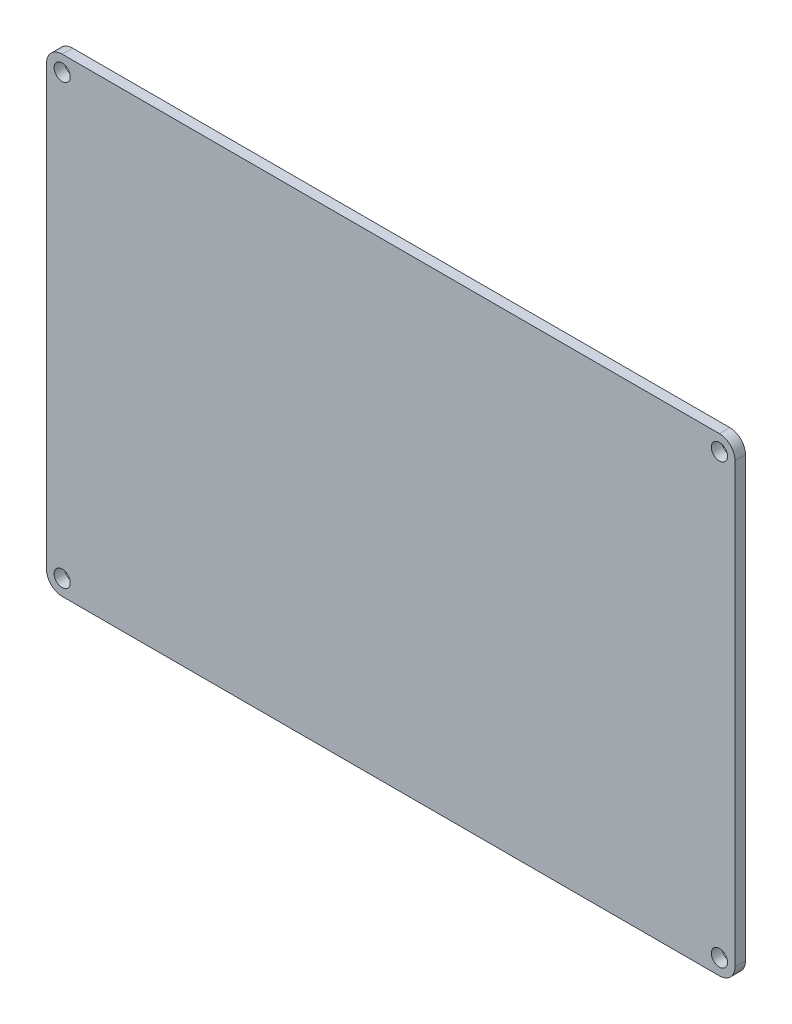
ISO-10303-21;
HEADER;
FILE_DESCRIPTION(('STEP AP214'),'2;1');
FILE_NAME('part.step','',(''),(''),'','','');
FILE_SCHEMA(('AUTOMOTIVE_DESIGN { 1 0 10303 214 1 1 1 1 }'));
ENDSEC;
DATA;
#1=APPLICATION_CONTEXT('core data for automotive mechanical design processes');
#2=APPLICATION_PROTOCOL_DEFINITION('international standard','automotive_design',2000,#1);
#3=PRODUCT_CONTEXT('',#1,'mechanical');
#4=PRODUCT('Part','Part','',(#3));
#5=PRODUCT_RELATED_PRODUCT_CATEGORY('part','',(#4));
#6=PRODUCT_DEFINITION_FORMATION('','',#4);
#7=PRODUCT_DEFINITION_CONTEXT('part definition',#1,'design');
#8=PRODUCT_DEFINITION('design','',#6,#7);
#9=PRODUCT_DEFINITION_SHAPE('','',#8);
#10=(LENGTH_UNIT() NAMED_UNIT(*) SI_UNIT(.MILLI.,.METRE.));
#11=(NAMED_UNIT(*) PLANE_ANGLE_UNIT() SI_UNIT($,.RADIAN.));
#12=(NAMED_UNIT(*) SI_UNIT($,.STERADIAN.) SOLID_ANGLE_UNIT());
#13=UNCERTAINTY_MEASURE_WITH_UNIT(LENGTH_MEASURE(1.E-05),#10,'distance_accuracy_value','');
#14=(GEOMETRIC_REPRESENTATION_CONTEXT(3) GLOBAL_UNCERTAINTY_ASSIGNED_CONTEXT((#13)) GLOBAL_UNIT_ASSIGNED_CONTEXT((#10,
#11,#12)) REPRESENTATION_CONTEXT('',''));
#15=CARTESIAN_POINT('',(0.,0.,0.));
#16=DIRECTION('',(0.,0.,1.));
#17=DIRECTION('',(1.,0.,0.));
#18=AXIS2_PLACEMENT_3D('',#15,#16,#17);
#19=CARTESIAN_POINT('',(62.9793043141552,42.,2.));
#20=DIRECTION('',(0.,0.,-1.));
#21=DIRECTION('',(-1.,0.,0.));
#22=AXIS2_PLACEMENT_3D('',#19,#20,#21);
#23=PLANE('',#22);
#24=CARTESIAN_POINT('',(62.9793043141552,42.,2.));
#25=DIRECTION('',(0.,0.,1.));
#26=DIRECTION('',(-1.,0.,0.));
#27=AXIS2_PLACEMENT_3D('',#24,#25,#26);
#28=CIRCLE('',#27,3.);
#29=CARTESIAN_POINT('',(65.9793043141552,42.,2.));
#30=VERTEX_POINT('',#29);
#31=CARTESIAN_POINT('',(62.9793043141552,45.,2.));
#32=VERTEX_POINT('',#31);
#33=EDGE_CURVE('E145',#30,#32,#28,.T.);
#34=ORIENTED_EDGE('',*,*,#33,.T.);
#35=DIRECTION('',(-1.,0.,0.));
#36=VECTOR('',#35,1.);
#37=CARTESIAN_POINT('',(-62.9793043141552,45.,2.));
#38=LINE('',#37,#36);
#39=CARTESIAN_POINT('',(-62.9793043141552,45.,2.));
#40=VERTEX_POINT('',#39);
#41=EDGE_CURVE('E93',#32,#40,#38,.T.);
#42=ORIENTED_EDGE('',*,*,#41,.T.);
#43=CARTESIAN_POINT('',(-62.9793043141552,42.,2.));
#44=DIRECTION('',(0.,0.,1.));
#45=DIRECTION('',(-1.,0.,0.));
#46=AXIS2_PLACEMENT_3D('',#43,#44,#45);
#47=CIRCLE('',#46,3.);
#48=CARTESIAN_POINT('',(-65.9793043141552,42.,2.));
#49=VERTEX_POINT('',#48);
#50=EDGE_CURVE('E160',#40,#49,#47,.T.);
#51=ORIENTED_EDGE('',*,*,#50,.T.);
#52=DIRECTION('',(0.,-1.,0.));
#53=VECTOR('',#52,1.);
#54=CARTESIAN_POINT('',(-65.9793043141552,-42.,2.));
#55=LINE('',#54,#53);
#56=CARTESIAN_POINT('',(-65.9793043141552,-42.,2.));
#57=VERTEX_POINT('',#56);
#58=EDGE_CURVE('E173',#49,#57,#55,.T.);
#59=ORIENTED_EDGE('',*,*,#58,.T.);
#60=CARTESIAN_POINT('',(-62.9793043141552,-42.,2.));
#61=DIRECTION('',(0.,0.,1.));
#62=DIRECTION('',(-1.,0.,0.));
#63=AXIS2_PLACEMENT_3D('',#60,#61,#62);
#64=CIRCLE('',#63,3.);
#65=CARTESIAN_POINT('',(-62.9793043141552,-45.,2.));
#66=VERTEX_POINT('',#65);
#67=EDGE_CURVE('E112',#57,#66,#64,.T.);
#68=ORIENTED_EDGE('',*,*,#67,.T.);
#69=DIRECTION('',(1.,0.,0.));
#70=VECTOR('',#69,1.);
#71=CARTESIAN_POINT('',(-62.9793043141552,-45.,2.));
#72=LINE('',#71,#70);
#73=CARTESIAN_POINT('',(62.9793043141552,-45.,2.));
#74=VERTEX_POINT('',#73);
#75=EDGE_CURVE('E106',#66,#74,#72,.T.);
#76=ORIENTED_EDGE('',*,*,#75,.T.);
#77=CARTESIAN_POINT('',(62.9793043141552,-42.,2.));
#78=DIRECTION('',(0.,0.,1.));
#79=DIRECTION('',(1.,0.,0.));
#80=AXIS2_PLACEMENT_3D('',#77,#78,#79);
#81=CIRCLE('',#80,3.);
#82=CARTESIAN_POINT('',(65.9793043141552,-42.,2.));
#83=VERTEX_POINT('',#82);
#84=EDGE_CURVE('E110',#74,#83,#81,.T.);
#85=ORIENTED_EDGE('',*,*,#84,.T.);
#86=DIRECTION('',(0.,1.,0.));
#87=VECTOR('',#86,1.);
#88=CARTESIAN_POINT('',(65.9793043141552,-42.,2.));
#89=LINE('',#88,#87);
#90=EDGE_CURVE('E50',#83,#30,#89,.T.);
#91=ORIENTED_EDGE('',*,*,#90,.T.);
#92=EDGE_LOOP('',(#34,#42,#51,#59,#68,#76,#85,#91));
#93=FACE_BOUND('',#92,.T.);
#94=CARTESIAN_POINT('',(-62.9793043141552,42.,2.));
#95=DIRECTION('',(0.,0.,1.));
#96=DIRECTION('',(1.,0.,0.));
#97=AXIS2_PLACEMENT_3D('',#94,#95,#96);
#98=CIRCLE('',#97,1.55);
#99=CARTESIAN_POINT('',(-61.4293043141552,42.,2.));
#100=VERTEX_POINT('',#99);
#101=EDGE_CURVE('E134',#100,#100,#98,.T.);
#102=ORIENTED_EDGE('',*,*,#101,.F.);
#103=EDGE_LOOP('',(#102));
#104=FACE_BOUND('',#103,.T.);
#105=CARTESIAN_POINT('',(-62.9793043141552,-42.,2.));
#106=DIRECTION('',(0.,0.,1.));
#107=DIRECTION('',(1.,0.,0.));
#108=AXIS2_PLACEMENT_3D('',#105,#106,#107);
#109=CIRCLE('',#108,1.55);
#110=CARTESIAN_POINT('',(-61.4293043141552,-42.,2.));
#111=VERTEX_POINT('',#110);
#112=EDGE_CURVE('E182',#111,#111,#109,.T.);
#113=ORIENTED_EDGE('',*,*,#112,.F.);
#114=EDGE_LOOP('',(#113));
#115=FACE_BOUND('',#114,.T.);
#116=CARTESIAN_POINT('',(62.9793043141552,-42.,2.));
#117=DIRECTION('',(0.,0.,1.));
#118=DIRECTION('',(1.,0.,0.));
#119=AXIS2_PLACEMENT_3D('',#116,#117,#118);
#120=CIRCLE('',#119,1.54999999999999);
#121=CARTESIAN_POINT('',(64.5293043141552,-42.,2.));
#122=VERTEX_POINT('',#121);
#123=EDGE_CURVE('E188',#122,#122,#120,.T.);
#124=ORIENTED_EDGE('',*,*,#123,.F.);
#125=EDGE_LOOP('',(#124));
#126=FACE_BOUND('',#125,.T.);
#127=CARTESIAN_POINT('',(62.9793043141552,42.,2.));
#128=DIRECTION('',(0.,0.,1.));
#129=DIRECTION('',(1.,0.,0.));
#130=AXIS2_PLACEMENT_3D('',#127,#128,#129);
#131=CIRCLE('',#130,1.54999999999999);
#132=CARTESIAN_POINT('',(64.5293043141552,42.,2.));
#133=VERTEX_POINT('',#132);
#134=EDGE_CURVE('E194',#133,#133,#131,.T.);
#135=ORIENTED_EDGE('',*,*,#134,.F.);
#136=EDGE_LOOP('',(#135));
#137=FACE_BOUND('',#136,.T.);
#138=ADVANCED_FACE('F33',(#93,#104,#115,#126,#137),#23,.F.);
#139=CARTESIAN_POINT('',(62.9793043141552,42.,0.));
#140=DIRECTION('',(0.,0.,-1.));
#141=DIRECTION('',(-1.,0.,0.));
#142=AXIS2_PLACEMENT_3D('',#139,#140,#141);
#143=PLANE('',#142);
#144=CARTESIAN_POINT('',(62.9793043141552,-42.,0.));
#145=DIRECTION('',(0.,0.,1.));
#146=DIRECTION('',(1.,0.,0.));
#147=AXIS2_PLACEMENT_3D('',#144,#145,#146);
#148=CIRCLE('',#147,1.54999999999999);
#149=CARTESIAN_POINT('',(64.5293043141552,-42.,0.));
#150=VERTEX_POINT('',#149);
#151=EDGE_CURVE('E191',#150,#150,#148,.T.);
#152=ORIENTED_EDGE('',*,*,#151,.T.);
#153=EDGE_LOOP('',(#152));
#154=FACE_BOUND('',#153,.T.);
#155=CARTESIAN_POINT('',(-62.9793043141552,42.,0.));
#156=DIRECTION('',(0.,0.,1.));
#157=DIRECTION('',(1.,0.,0.));
#158=AXIS2_PLACEMENT_3D('',#155,#156,#157);
#159=CIRCLE('',#158,1.55);
#160=CARTESIAN_POINT('',(-61.4293043141552,42.,0.));
#161=VERTEX_POINT('',#160);
#162=EDGE_CURVE('E179',#161,#161,#159,.T.);
#163=ORIENTED_EDGE('',*,*,#162,.T.);
#164=EDGE_LOOP('',(#163));
#165=FACE_BOUND('',#164,.T.);
#166=CARTESIAN_POINT('',(62.9793043141552,42.,0.));
#167=DIRECTION('',(0.,0.,1.));
#168=DIRECTION('',(-1.,0.,0.));
#169=AXIS2_PLACEMENT_3D('',#166,#167,#168);
#170=CIRCLE('',#169,3.);
#171=CARTESIAN_POINT('',(65.9793043141552,42.,0.));
#172=VERTEX_POINT('',#171);
#173=CARTESIAN_POINT('',(62.9793043141552,45.,0.));
#174=VERTEX_POINT('',#173);
#175=EDGE_CURVE('E130',#172,#174,#170,.T.);
#176=ORIENTED_EDGE('',*,*,#175,.F.);
#177=DIRECTION('',(0.,1.,0.));
#178=VECTOR('',#177,1.);
#179=CARTESIAN_POINT('',(65.9793043141552,-42.,0.));
#180=LINE('',#179,#178);
#181=CARTESIAN_POINT('',(65.9793043141552,-42.,0.));
#182=VERTEX_POINT('',#181);
#183=EDGE_CURVE('E85',#182,#172,#180,.T.);
#184=ORIENTED_EDGE('',*,*,#183,.F.);
#185=CARTESIAN_POINT('',(62.9793043141552,-42.,0.));
#186=DIRECTION('',(0.,0.,1.));
#187=DIRECTION('',(1.,0.,0.));
#188=AXIS2_PLACEMENT_3D('',#185,#186,#187);
#189=CIRCLE('',#188,3.);
#190=CARTESIAN_POINT('',(62.9793043141552,-45.,0.));
#191=VERTEX_POINT('',#190);
#192=EDGE_CURVE('E79',#191,#182,#189,.T.);
#193=ORIENTED_EDGE('',*,*,#192,.F.);
#194=DIRECTION('',(1.,0.,0.));
#195=VECTOR('',#194,1.);
#196=CARTESIAN_POINT('',(-62.9793043141552,-45.,0.));
#197=LINE('',#196,#195);
#198=CARTESIAN_POINT('',(-62.9793043141552,-45.,0.));
#199=VERTEX_POINT('',#198);
#200=EDGE_CURVE('E120',#199,#191,#197,.T.);
#201=ORIENTED_EDGE('',*,*,#200,.F.);
#202=CARTESIAN_POINT('',(-62.9793043141552,-42.,0.));
#203=DIRECTION('',(0.,0.,1.));
#204=DIRECTION('',(-1.,0.,0.));
#205=AXIS2_PLACEMENT_3D('',#202,#203,#204);
#206=CIRCLE('',#205,3.);
#207=CARTESIAN_POINT('',(-65.9793043141552,-42.,0.));
#208=VERTEX_POINT('',#207);
#209=EDGE_CURVE('E140',#208,#199,#206,.T.);
#210=ORIENTED_EDGE('',*,*,#209,.F.);
#211=DIRECTION('',(0.,-1.,0.));
#212=VECTOR('',#211,1.);
#213=CARTESIAN_POINT('',(-65.9793043141552,-42.,0.));
#214=LINE('',#213,#212);
#215=CARTESIAN_POINT('',(-65.9793043141552,42.,0.));
#216=VERTEX_POINT('',#215);
#217=EDGE_CURVE('E138',#216,#208,#214,.T.);
#218=ORIENTED_EDGE('',*,*,#217,.F.);
#219=CARTESIAN_POINT('',(-62.9793043141552,42.,0.));
#220=DIRECTION('',(0.,0.,1.));
#221=DIRECTION('',(-1.,0.,0.));
#222=AXIS2_PLACEMENT_3D('',#219,#220,#221);
#223=CIRCLE('',#222,3.);
#224=CARTESIAN_POINT('',(-62.9793043141552,45.,0.));
#225=VERTEX_POINT('',#224);
#226=EDGE_CURVE('E136',#225,#216,#223,.T.);
#227=ORIENTED_EDGE('',*,*,#226,.F.);
#228=DIRECTION('',(-1.,0.,0.));
#229=VECTOR('',#228,1.);
#230=CARTESIAN_POINT('',(-62.9793043141552,45.,0.));
#231=LINE('',#230,#229);
#232=EDGE_CURVE('E133',#174,#225,#231,.T.);
#233=ORIENTED_EDGE('',*,*,#232,.F.);
#234=EDGE_LOOP('',(#176,#184,#193,#201,#210,#218,#227,#233));
#235=FACE_BOUND('',#234,.T.);
#236=CARTESIAN_POINT('',(-62.9793043141552,-42.,0.));
#237=DIRECTION('',(0.,0.,1.));
#238=DIRECTION('',(1.,0.,0.));
#239=AXIS2_PLACEMENT_3D('',#236,#237,#238);
#240=CIRCLE('',#239,1.55);
#241=CARTESIAN_POINT('',(-61.4293043141552,-42.,0.));
#242=VERTEX_POINT('',#241);
#243=EDGE_CURVE('E185',#242,#242,#240,.T.);
#244=ORIENTED_EDGE('',*,*,#243,.T.);
#245=EDGE_LOOP('',(#244));
#246=FACE_BOUND('',#245,.T.);
#247=CARTESIAN_POINT('',(62.9793043141552,42.,0.));
#248=DIRECTION('',(0.,0.,1.));
#249=DIRECTION('',(1.,0.,0.));
#250=AXIS2_PLACEMENT_3D('',#247,#248,#249);
#251=CIRCLE('',#250,1.54999999999999);
#252=CARTESIAN_POINT('',(64.5293043141552,42.,0.));
#253=VERTEX_POINT('',#252);
#254=EDGE_CURVE('E197',#253,#253,#251,.T.);
#255=ORIENTED_EDGE('',*,*,#254,.T.);
#256=EDGE_LOOP('',(#255));
#257=FACE_BOUND('',#256,.T.);
#258=ADVANCED_FACE('F164',(#154,#165,#235,#246,#257),#143,.T.);
#259=CARTESIAN_POINT('',(62.9793043141552,42.,2.));
#260=DIRECTION('',(0.,0.,-1.));
#261=DIRECTION('',(-1.,0.,0.));
#262=AXIS2_PLACEMENT_3D('',#259,#260,#261);
#263=CYLINDRICAL_SURFACE('',#262,3.);
#264=ORIENTED_EDGE('',*,*,#175,.T.);
#265=DIRECTION('',(0.,0.,-1.));
#266=VECTOR('',#265,1.);
#267=CARTESIAN_POINT('',(62.9793043141552,45.,2.));
#268=LINE('',#267,#266);
#269=EDGE_CURVE('E11',#32,#174,#268,.T.);
#270=ORIENTED_EDGE('',*,*,#269,.F.);
#271=ORIENTED_EDGE('',*,*,#33,.F.);
#272=DIRECTION('',(0.,0.,-1.));
#273=VECTOR('',#272,1.);
#274=CARTESIAN_POINT('',(65.9793043141552,42.,2.));
#275=LINE('',#274,#273);
#276=EDGE_CURVE('E126',#30,#172,#275,.T.);
#277=ORIENTED_EDGE('',*,*,#276,.T.);
#278=EDGE_LOOP('',(#264,#270,#271,#277));
#279=FACE_BOUND('',#278,.T.);
#280=ADVANCED_FACE('F35',(#279),#263,.T.);
#281=CARTESIAN_POINT('',(-62.9793043141552,45.,2.));
#282=DIRECTION('',(0.,-1.,0.));
#283=DIRECTION('',(0.,0.,-1.));
#284=AXIS2_PLACEMENT_3D('',#281,#282,#283);
#285=PLANE('',#284);
#286=ORIENTED_EDGE('',*,*,#232,.T.);
#287=DIRECTION('',(0.,0.,-1.));
#288=VECTOR('',#287,1.);
#289=CARTESIAN_POINT('',(-62.9793043141552,45.,2.));
#290=LINE('',#289,#288);
#291=EDGE_CURVE('E42',#40,#225,#290,.T.);
#292=ORIENTED_EDGE('',*,*,#291,.F.);
#293=ORIENTED_EDGE('',*,*,#41,.F.);
#294=ORIENTED_EDGE('',*,*,#269,.T.);
#295=EDGE_LOOP('',(#286,#292,#293,#294));
#296=FACE_BOUND('',#295,.T.);
#297=ADVANCED_FACE('F229',(#296),#285,.F.);
#298=CARTESIAN_POINT('',(-62.9793043141552,42.,2.));
#299=DIRECTION('',(0.,0.,-1.));
#300=DIRECTION('',(-1.,0.,0.));
#301=AXIS2_PLACEMENT_3D('',#298,#299,#300);
#302=CYLINDRICAL_SURFACE('',#301,3.);
#303=ORIENTED_EDGE('',*,*,#226,.T.);
#304=DIRECTION('',(0.,0.,-1.));
#305=VECTOR('',#304,1.);
#306=CARTESIAN_POINT('',(-65.9793043141552,42.,2.));
#307=LINE('',#306,#305);
#308=EDGE_CURVE('E152',#49,#216,#307,.T.);
#309=ORIENTED_EDGE('',*,*,#308,.F.);
#310=ORIENTED_EDGE('',*,*,#50,.F.);
#311=ORIENTED_EDGE('',*,*,#291,.T.);
#312=EDGE_LOOP('',(#303,#309,#310,#311));
#313=FACE_BOUND('',#312,.T.);
#314=ADVANCED_FACE('F158',(#313),#302,.T.);
#315=CARTESIAN_POINT('',(-65.9793043141552,-42.,2.));
#316=DIRECTION('',(1.,0.,0.));
#317=DIRECTION('',(0.,0.,-1.));
#318=AXIS2_PLACEMENT_3D('',#315,#316,#317);
#319=PLANE('',#318);
#320=ORIENTED_EDGE('',*,*,#217,.T.);
#321=DIRECTION('',(0.,0.,-1.));
#322=VECTOR('',#321,1.);
#323=CARTESIAN_POINT('',(-65.9793043141552,-42.,2.));
#324=LINE('',#323,#322);
#325=EDGE_CURVE('E149',#57,#208,#324,.T.);
#326=ORIENTED_EDGE('',*,*,#325,.F.);
#327=ORIENTED_EDGE('',*,*,#58,.F.);
#328=ORIENTED_EDGE('',*,*,#308,.T.);
#329=EDGE_LOOP('',(#320,#326,#327,#328));
#330=FACE_BOUND('',#329,.T.);
#331=ADVANCED_FACE('F169',(#330),#319,.F.);
#332=CARTESIAN_POINT('',(-62.9793043141552,-42.,2.));
#333=DIRECTION('',(0.,0.,-1.));
#334=DIRECTION('',(-1.,0.,0.));
#335=AXIS2_PLACEMENT_3D('',#332,#333,#334);
#336=CYLINDRICAL_SURFACE('',#335,3.);
#337=ORIENTED_EDGE('',*,*,#209,.T.);
#338=DIRECTION('',(0.,0.,-1.));
#339=VECTOR('',#338,1.);
#340=CARTESIAN_POINT('',(-62.9793043141552,-45.,2.));
#341=LINE('',#340,#339);
#342=EDGE_CURVE('E121',#66,#199,#341,.T.);
#343=ORIENTED_EDGE('',*,*,#342,.F.);
#344=ORIENTED_EDGE('',*,*,#67,.F.);
#345=ORIENTED_EDGE('',*,*,#325,.T.);
#346=EDGE_LOOP('',(#337,#343,#344,#345));
#347=FACE_BOUND('',#346,.T.);
#348=ADVANCED_FACE('F172',(#347),#336,.T.);
#349=CARTESIAN_POINT('',(-62.9793043141552,-45.,2.));
#350=DIRECTION('',(0.,1.,0.));
#351=DIRECTION('',(0.,0.,1.));
#352=AXIS2_PLACEMENT_3D('',#349,#350,#351);
#353=PLANE('',#352);
#354=ORIENTED_EDGE('',*,*,#200,.T.);
#355=DIRECTION('',(0.,0.,-1.));
#356=VECTOR('',#355,1.);
#357=CARTESIAN_POINT('',(62.9793043141552,-45.,2.));
#358=LINE('',#357,#356);
#359=EDGE_CURVE('E117',#74,#191,#358,.T.);
#360=ORIENTED_EDGE('',*,*,#359,.F.);
#361=ORIENTED_EDGE('',*,*,#75,.F.);
#362=ORIENTED_EDGE('',*,*,#342,.T.);
#363=EDGE_LOOP('',(#354,#360,#361,#362));
#364=FACE_BOUND('',#363,.T.);
#365=ADVANCED_FACE('F118',(#364),#353,.F.);
#366=CARTESIAN_POINT('',(62.9793043141552,-42.,2.));
#367=DIRECTION('',(0.,0.,-1.));
#368=DIRECTION('',(-1.,0.,0.));
#369=AXIS2_PLACEMENT_3D('',#366,#367,#368);
#370=CYLINDRICAL_SURFACE('',#369,3.);
#371=ORIENTED_EDGE('',*,*,#192,.T.);
#372=DIRECTION('',(0.,0.,-1.));
#373=VECTOR('',#372,1.);
#374=CARTESIAN_POINT('',(65.9793043141552,-42.,2.));
#375=LINE('',#374,#373);
#376=EDGE_CURVE('E122',#83,#182,#375,.T.);
#377=ORIENTED_EDGE('',*,*,#376,.F.);
#378=ORIENTED_EDGE('',*,*,#84,.F.);
#379=ORIENTED_EDGE('',*,*,#359,.T.);
#380=EDGE_LOOP('',(#371,#377,#378,#379));
#381=FACE_BOUND('',#380,.T.);
#382=ADVANCED_FACE('F124',(#381),#370,.T.);
#383=CARTESIAN_POINT('',(65.9793043141552,-42.,2.));
#384=DIRECTION('',(-1.,0.,0.));
#385=DIRECTION('',(0.,0.,1.));
#386=AXIS2_PLACEMENT_3D('',#383,#384,#385);
#387=PLANE('',#386);
#388=ORIENTED_EDGE('',*,*,#183,.T.);
#389=ORIENTED_EDGE('',*,*,#276,.F.);
#390=ORIENTED_EDGE('',*,*,#90,.F.);
#391=ORIENTED_EDGE('',*,*,#376,.T.);
#392=EDGE_LOOP('',(#388,#389,#390,#391));
#393=FACE_BOUND('',#392,.T.);
#394=ADVANCED_FACE('F217',(#393),#387,.F.);
#395=CARTESIAN_POINT('',(-62.9793043141552,42.,2.));
#396=DIRECTION('',(0.,0.,-1.));
#397=DIRECTION('',(-1.,0.,0.));
#398=AXIS2_PLACEMENT_3D('',#395,#396,#397);
#399=CYLINDRICAL_SURFACE('',#398,1.55);
#400=ORIENTED_EDGE('',*,*,#101,.T.);
#401=EDGE_LOOP('',(#400));
#402=FACE_BOUND('',#401,.T.);
#403=ORIENTED_EDGE('',*,*,#162,.F.);
#404=EDGE_LOOP('',(#403));
#405=FACE_BOUND('',#404,.T.);
#406=ADVANCED_FACE('F214',(#402,#405),#399,.F.);
#407=CARTESIAN_POINT('',(-62.9793043141552,-42.,2.));
#408=DIRECTION('',(0.,0.,-1.));
#409=DIRECTION('',(-1.,0.,0.));
#410=AXIS2_PLACEMENT_3D('',#407,#408,#409);
#411=CYLINDRICAL_SURFACE('',#410,1.55);
#412=ORIENTED_EDGE('',*,*,#112,.T.);
#413=EDGE_LOOP('',(#412));
#414=FACE_BOUND('',#413,.T.);
#415=ORIENTED_EDGE('',*,*,#243,.F.);
#416=EDGE_LOOP('',(#415));
#417=FACE_BOUND('',#416,.T.);
#418=ADVANCED_FACE('F293',(#414,#417),#411,.F.);
#419=CARTESIAN_POINT('',(62.9793043141552,-42.,2.));
#420=DIRECTION('',(0.,0.,-1.));
#421=DIRECTION('',(-1.,0.,0.));
#422=AXIS2_PLACEMENT_3D('',#419,#420,#421);
#423=CYLINDRICAL_SURFACE('',#422,1.54999999999999);
#424=ORIENTED_EDGE('',*,*,#123,.T.);
#425=EDGE_LOOP('',(#424));
#426=FACE_BOUND('',#425,.T.);
#427=ORIENTED_EDGE('',*,*,#151,.F.);
#428=EDGE_LOOP('',(#427));
#429=FACE_BOUND('',#428,.T.);
#430=ADVANCED_FACE('F301',(#426,#429),#423,.F.);
#431=CARTESIAN_POINT('',(62.9793043141552,42.,2.));
#432=DIRECTION('',(0.,0.,-1.));
#433=DIRECTION('',(-1.,0.,0.));
#434=AXIS2_PLACEMENT_3D('',#431,#432,#433);
#435=CYLINDRICAL_SURFACE('',#434,1.54999999999999);
#436=ORIENTED_EDGE('',*,*,#134,.T.);
#437=EDGE_LOOP('',(#436));
#438=FACE_BOUND('',#437,.T.);
#439=ORIENTED_EDGE('',*,*,#254,.F.);
#440=EDGE_LOOP('',(#439));
#441=FACE_BOUND('',#440,.T.);
#442=ADVANCED_FACE('F203',(#438,#441),#435,.F.);
#443=CLOSED_SHELL('',(#138,#258,#280,#297,#314,#331,#348,#365,#382,#394,#406,#418,#430,#442));
#444=MANIFOLD_SOLID_BREP('B2',#443);
#445=ADVANCED_BREP_SHAPE_REPRESENTATION('',(#18,#444),#14);
#446=SHAPE_DEFINITION_REPRESENTATION(#9,#445);
ENDSEC;
END-ISO-10303-21;
